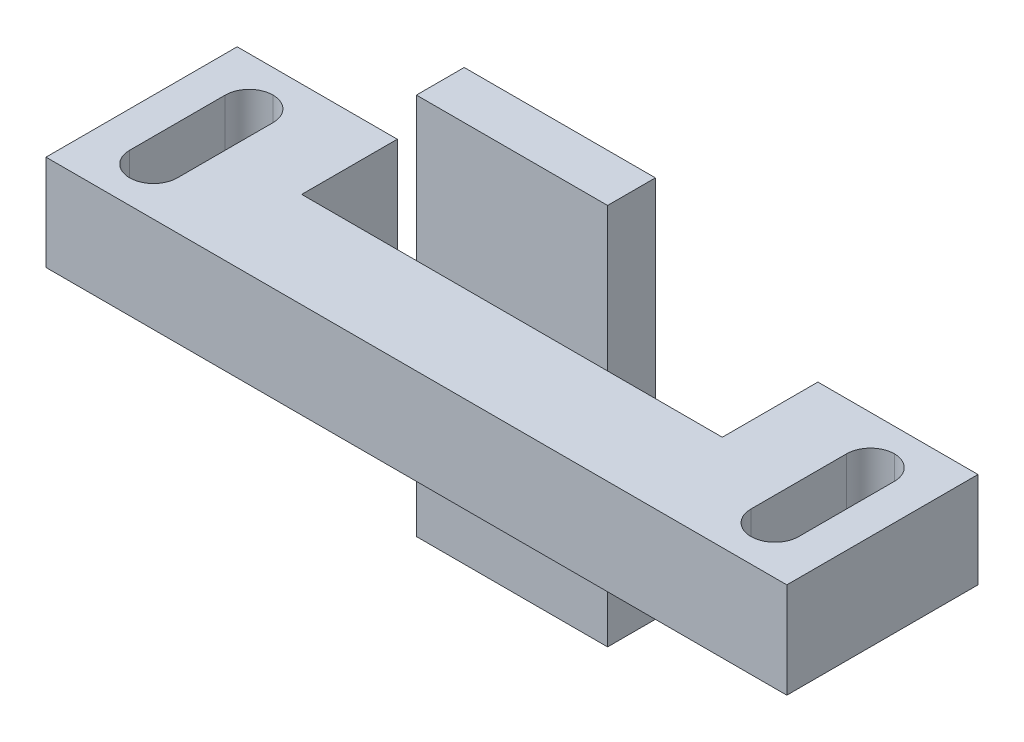
ISO-10303-21;
HEADER;
FILE_DESCRIPTION(('STEP AP214'),'2;1');
FILE_NAME('part.step','',(''),(''),'','','');
FILE_SCHEMA(('AUTOMOTIVE_DESIGN { 1 0 10303 214 1 1 1 1 }'));
ENDSEC;
DATA;
#1=APPLICATION_CONTEXT('core data for automotive mechanical design processes');
#2=APPLICATION_PROTOCOL_DEFINITION('international standard','automotive_design',2000,#1);
#3=PRODUCT_CONTEXT('',#1,'mechanical');
#4=PRODUCT('Part','Part','',(#3));
#5=PRODUCT_RELATED_PRODUCT_CATEGORY('part','',(#4));
#6=PRODUCT_DEFINITION_FORMATION('','',#4);
#7=PRODUCT_DEFINITION_CONTEXT('part definition',#1,'design');
#8=PRODUCT_DEFINITION('design','',#6,#7);
#9=PRODUCT_DEFINITION_SHAPE('','',#8);
#10=(LENGTH_UNIT() NAMED_UNIT(*) SI_UNIT(.MILLI.,.METRE.));
#11=(NAMED_UNIT(*) PLANE_ANGLE_UNIT() SI_UNIT($,.RADIAN.));
#12=(NAMED_UNIT(*) SI_UNIT($,.STERADIAN.) SOLID_ANGLE_UNIT());
#13=UNCERTAINTY_MEASURE_WITH_UNIT(LENGTH_MEASURE(1.E-05),#10,'distance_accuracy_value','');
#14=(GEOMETRIC_REPRESENTATION_CONTEXT(3) GLOBAL_UNCERTAINTY_ASSIGNED_CONTEXT((#13)) GLOBAL_UNIT_ASSIGNED_CONTEXT((#10,
#11,#12)) REPRESENTATION_CONTEXT('',''));
#15=CARTESIAN_POINT('',(0.,0.,0.));
#16=DIRECTION('',(0.,0.,1.));
#17=DIRECTION('',(1.,0.,0.));
#18=AXIS2_PLACEMENT_3D('',#15,#16,#17);
#19=CARTESIAN_POINT('',(-27.94,-6.351,0.));
#20=DIRECTION('',(0.,0.,1.));
#21=DIRECTION('',(1.,0.,0.));
#22=AXIS2_PLACEMENT_3D('',#19,#20,#21);
#23=PLANE('',#22);
#24=DIRECTION('',(0.,-1.,0.));
#25=VECTOR('',#24,1.);
#26=CARTESIAN_POINT('',(12.7,-6.35100000000001,0.));
#27=LINE('',#26,#25);
#28=CARTESIAN_POINT('',(12.7,6.35,0.));
#29=VERTEX_POINT('',#28);
#30=CARTESIAN_POINT('',(12.7,-6.35,0.));
#31=VERTEX_POINT('',#30);
#32=EDGE_CURVE('E11',#29,#31,#27,.T.);
#33=ORIENTED_EDGE('',*,*,#32,.F.);
#34=DIRECTION('',(1.,0.,0.));
#35=VECTOR('',#34,1.);
#36=CARTESIAN_POINT('',(-27.94,6.35,0.));
#37=LINE('',#36,#35);
#38=CARTESIAN_POINT('',(27.94,6.35,0.));
#39=VERTEX_POINT('',#38);
#40=EDGE_CURVE('E243',#29,#39,#37,.T.);
#41=ORIENTED_EDGE('',*,*,#40,.T.);
#42=DIRECTION('',(0.,1.,0.));
#43=VECTOR('',#42,1.);
#44=CARTESIAN_POINT('',(27.94,-6.351,0.));
#45=LINE('',#44,#43);
#46=CARTESIAN_POINT('',(27.94,-6.35,0.));
#47=VERTEX_POINT('',#46);
#48=EDGE_CURVE('E256',#47,#39,#45,.T.);
#49=ORIENTED_EDGE('',*,*,#48,.F.);
#50=DIRECTION('',(-1.,0.,0.));
#51=VECTOR('',#50,1.);
#52=CARTESIAN_POINT('',(-27.94,-6.35,0.));
#53=LINE('',#52,#51);
#54=EDGE_CURVE('E260',#47,#31,#53,.T.);
#55=ORIENTED_EDGE('',*,*,#54,.T.);
#56=EDGE_LOOP('',(#33,#41,#49,#55));
#57=FACE_BOUND('',#56,.T.);
#58=ADVANCED_FACE('F33',(#57),#23,.F.);
#59=DIRECTION('',(0.,1.,0.));
#60=VECTOR('',#59,1.);
#61=CARTESIAN_POINT('',(-12.7,-6.351,0.));
#62=LINE('',#61,#60);
#63=CARTESIAN_POINT('',(-12.7,-6.35,0.));
#64=VERTEX_POINT('',#63);
#65=CARTESIAN_POINT('',(-12.7,6.35,0.));
#66=VERTEX_POINT('',#65);
#67=EDGE_CURVE('E41',#64,#66,#62,.T.);
#68=ORIENTED_EDGE('',*,*,#67,.F.);
#69=CARTESIAN_POINT('',(-27.94,-6.35,0.));
#70=VERTEX_POINT('',#69);
#71=EDGE_CURVE('E252',#64,#70,#53,.T.);
#72=ORIENTED_EDGE('',*,*,#71,.T.);
#73=DIRECTION('',(0.,1.,0.));
#74=VECTOR('',#73,1.);
#75=CARTESIAN_POINT('',(-27.94,-6.351,0.));
#76=LINE('',#75,#74);
#77=CARTESIAN_POINT('',(-27.94,6.35,0.));
#78=VERTEX_POINT('',#77);
#79=EDGE_CURVE('E249',#70,#78,#76,.T.);
#80=ORIENTED_EDGE('',*,*,#79,.T.);
#81=EDGE_CURVE('E244',#78,#66,#37,.T.);
#82=ORIENTED_EDGE('',*,*,#81,.T.);
#83=EDGE_LOOP('',(#68,#72,#80,#82));
#84=FACE_BOUND('',#83,.T.);
#85=ADVANCED_FACE('F423',(#84),#23,.F.);
#86=CARTESIAN_POINT('',(0.,0.,-12.7));
#87=DIRECTION('',(0.,0.,1.));
#88=DIRECTION('',(1.,0.,0.));
#89=AXIS2_PLACEMENT_3D('',#86,#87,#88);
#90=PLANE('',#89);
#91=DIRECTION('',(-1.,0.,0.));
#92=VECTOR('',#91,1.);
#93=CARTESIAN_POINT('',(-49.2125,6.35,-12.7));
#94=LINE('',#93,#92);
#95=CARTESIAN_POINT('',(-27.94,6.35,-12.7));
#96=VERTEX_POINT('',#95);
#97=CARTESIAN_POINT('',(-49.2125,6.35,-12.7));
#98=VERTEX_POINT('',#97);
#99=EDGE_CURVE('E303',#96,#98,#94,.T.);
#100=ORIENTED_EDGE('',*,*,#99,.F.);
#101=DIRECTION('',(0.,1.,0.));
#102=VECTOR('',#101,1.);
#103=CARTESIAN_POINT('',(-27.94,-6.351,-12.7));
#104=LINE('',#103,#102);
#105=CARTESIAN_POINT('',(-27.94,-6.35,-12.7));
#106=VERTEX_POINT('',#105);
#107=EDGE_CURVE('E250',#106,#96,#104,.T.);
#108=ORIENTED_EDGE('',*,*,#107,.F.);
#109=DIRECTION('',(1.,0.,0.));
#110=VECTOR('',#109,1.);
#111=CARTESIAN_POINT('',(-49.2125,-6.35,-12.7));
#112=LINE('',#111,#110);
#113=CARTESIAN_POINT('',(-49.2125,-6.35,-12.7));
#114=VERTEX_POINT('',#113);
#115=EDGE_CURVE('E298',#114,#106,#112,.T.);
#116=ORIENTED_EDGE('',*,*,#115,.F.);
#117=DIRECTION('',(0.,-1.,0.));
#118=VECTOR('',#117,1.);
#119=CARTESIAN_POINT('',(-49.2125,6.35,-12.7));
#120=LINE('',#119,#118);
#121=EDGE_CURVE('E283',#98,#114,#120,.T.);
#122=ORIENTED_EDGE('',*,*,#121,.F.);
#123=EDGE_LOOP('',(#100,#108,#116,#122));
#124=FACE_BOUND('',#123,.T.);
#125=ADVANCED_FACE('F436',(#124),#90,.F.);
#126=CARTESIAN_POINT('',(41.275,-6.351,6.35));
#127=DIRECTION('',(0.,1.,0.));
#128=DIRECTION('',(0.,0.,1.));
#129=AXIS2_PLACEMENT_3D('',#126,#127,#128);
#130=CYLINDRICAL_SURFACE('',#129,3.175);
#131=DIRECTION('',(0.,-1.,0.));
#132=VECTOR('',#131,1.);
#133=CARTESIAN_POINT('',(38.1,-6.351,6.35));
#134=LINE('',#133,#132);
#135=CARTESIAN_POINT('',(38.1,6.35,6.35));
#136=VERTEX_POINT('',#135);
#137=CARTESIAN_POINT('',(38.1,-6.35,6.35));
#138=VERTEX_POINT('',#137);
#139=EDGE_CURVE('E384',#136,#138,#134,.T.);
#140=ORIENTED_EDGE('',*,*,#139,.F.);
#141=CARTESIAN_POINT('',(41.275,6.35,6.35));
#142=DIRECTION('',(0.,-1.,0.));
#143=DIRECTION('',(0.,0.,-1.));
#144=AXIS2_PLACEMENT_3D('',#141,#142,#143);
#145=CIRCLE('',#144,3.175);
#146=CARTESIAN_POINT('',(41.275,6.35,9.525));
#147=VERTEX_POINT('',#146);
#148=EDGE_CURVE('E387',#136,#147,#145,.F.);
#149=ORIENTED_EDGE('',*,*,#148,.T.);
#150=DIRECTION('',(0.,1.,0.));
#151=VECTOR('',#150,1.);
#152=CARTESIAN_POINT('',(41.275,-6.351,9.525));
#153=LINE('',#152,#151);
#154=CARTESIAN_POINT('',(41.275,-6.35,9.525));
#155=VERTEX_POINT('',#154);
#156=EDGE_CURVE('E376',#147,#155,#153,.F.);
#157=ORIENTED_EDGE('',*,*,#156,.T.);
#158=CARTESIAN_POINT('',(41.275,-6.35,6.35));
#159=DIRECTION('',(0.,1.,0.));
#160=DIRECTION('',(0.,0.,1.));
#161=AXIS2_PLACEMENT_3D('',#158,#159,#160);
#162=CIRCLE('',#161,3.175);
#163=EDGE_CURVE('E389',#155,#138,#162,.F.);
#164=ORIENTED_EDGE('',*,*,#163,.T.);
#165=EDGE_LOOP('',(#140,#149,#157,#164));
#166=FACE_BOUND('',#165,.T.);
#167=ADVANCED_FACE('F35',(#166),#130,.F.);
#168=CARTESIAN_POINT('',(41.275,-6.351,6.35));
#169=DIRECTION('',(0.,-1.,0.));
#170=DIRECTION('',(0.,0.,-1.));
#171=AXIS2_PLACEMENT_3D('',#168,#169,#170);
#172=CYLINDRICAL_SURFACE('',#171,3.175);
#173=DIRECTION('',(0.,1.,0.));
#174=VECTOR('',#173,1.);
#175=CARTESIAN_POINT('',(44.45,-6.351,6.35));
#176=LINE('',#175,#174);
#177=CARTESIAN_POINT('',(44.45,-6.35,6.35));
#178=VERTEX_POINT('',#177);
#179=CARTESIAN_POINT('',(44.45,6.35,6.35));
#180=VERTEX_POINT('',#179);
#181=EDGE_CURVE('E373',#178,#180,#176,.T.);
#182=ORIENTED_EDGE('',*,*,#181,.F.);
#183=CARTESIAN_POINT('',(41.275,-6.35,6.35));
#184=DIRECTION('',(0.,1.,0.));
#185=DIRECTION('',(0.,0.,1.));
#186=AXIS2_PLACEMENT_3D('',#183,#184,#185);
#187=CIRCLE('',#186,3.175);
#188=EDGE_CURVE('E379',#178,#155,#187,.F.);
#189=ORIENTED_EDGE('',*,*,#188,.T.);
#190=ORIENTED_EDGE('',*,*,#156,.F.);
#191=CARTESIAN_POINT('',(41.275,6.35,6.35));
#192=DIRECTION('',(0.,-1.,0.));
#193=DIRECTION('',(0.,0.,-1.));
#194=AXIS2_PLACEMENT_3D('',#191,#192,#193);
#195=CIRCLE('',#194,3.175);
#196=EDGE_CURVE('E382',#147,#180,#195,.F.);
#197=ORIENTED_EDGE('',*,*,#196,.T.);
#198=EDGE_LOOP('',(#182,#189,#190,#197));
#199=FACE_BOUND('',#198,.T.);
#200=ADVANCED_FACE('F517',(#199),#172,.F.);
#201=CARTESIAN_POINT('',(41.275,-6.351,-6.35));
#202=DIRECTION('',(0.,1.,0.));
#203=DIRECTION('',(0.,0.,1.));
#204=AXIS2_PLACEMENT_3D('',#201,#202,#203);
#205=CYLINDRICAL_SURFACE('',#204,3.175);
#206=DIRECTION('',(0.,-1.,0.));
#207=VECTOR('',#206,1.);
#208=CARTESIAN_POINT('',(38.1,-6.351,-6.35));
#209=LINE('',#208,#207);
#210=CARTESIAN_POINT('',(38.1,-6.35,-6.35));
#211=VERTEX_POINT('',#210);
#212=CARTESIAN_POINT('',(38.1,6.35,-6.35));
#213=VERTEX_POINT('',#212);
#214=EDGE_CURVE('E365',#211,#213,#209,.F.);
#215=ORIENTED_EDGE('',*,*,#214,.F.);
#216=CARTESIAN_POINT('',(41.275,-6.35,-6.35));
#217=DIRECTION('',(0.,1.,0.));
#218=DIRECTION('',(0.,0.,1.));
#219=AXIS2_PLACEMENT_3D('',#216,#217,#218);
#220=CIRCLE('',#219,3.175);
#221=CARTESIAN_POINT('',(41.275,-6.35,-9.525));
#222=VERTEX_POINT('',#221);
#223=EDGE_CURVE('E371',#211,#222,#220,.F.);
#224=ORIENTED_EDGE('',*,*,#223,.T.);
#225=DIRECTION('',(0.,-1.,0.));
#226=VECTOR('',#225,1.);
#227=CARTESIAN_POINT('',(41.275,-6.351,-9.525));
#228=LINE('',#227,#226);
#229=CARTESIAN_POINT('',(41.275,6.35,-9.525));
#230=VERTEX_POINT('',#229);
#231=EDGE_CURVE('E356',#222,#230,#228,.F.);
#232=ORIENTED_EDGE('',*,*,#231,.T.);
#233=CARTESIAN_POINT('',(41.275,6.35,-6.35));
#234=DIRECTION('',(0.,-1.,0.));
#235=DIRECTION('',(0.,0.,-1.));
#236=AXIS2_PLACEMENT_3D('',#233,#234,#235);
#237=CIRCLE('',#236,3.175);
#238=EDGE_CURVE('E368',#230,#213,#237,.F.);
#239=ORIENTED_EDGE('',*,*,#238,.T.);
#240=EDGE_LOOP('',(#215,#224,#232,#239));
#241=FACE_BOUND('',#240,.T.);
#242=ADVANCED_FACE('F511',(#241),#205,.F.);
#243=CARTESIAN_POINT('',(41.275,-6.351,-6.35));
#244=DIRECTION('',(0.,1.,0.));
#245=DIRECTION('',(0.,0.,1.));
#246=AXIS2_PLACEMENT_3D('',#243,#244,#245);
#247=CYLINDRICAL_SURFACE('',#246,3.175);
#248=DIRECTION('',(0.,-1.,0.));
#249=VECTOR('',#248,1.);
#250=CARTESIAN_POINT('',(44.45,-6.351,-6.35));
#251=LINE('',#250,#249);
#252=CARTESIAN_POINT('',(44.45,6.35,-6.35));
#253=VERTEX_POINT('',#252);
#254=CARTESIAN_POINT('',(44.45,-6.35,-6.35));
#255=VERTEX_POINT('',#254);
#256=EDGE_CURVE('E353',#253,#255,#251,.T.);
#257=ORIENTED_EDGE('',*,*,#256,.F.);
#258=CARTESIAN_POINT('',(41.275,6.35,-6.35));
#259=DIRECTION('',(0.,-1.,0.));
#260=DIRECTION('',(0.,0.,-1.));
#261=AXIS2_PLACEMENT_3D('',#258,#259,#260);
#262=CIRCLE('',#261,3.175);
#263=EDGE_CURVE('E359',#253,#230,#262,.F.);
#264=ORIENTED_EDGE('',*,*,#263,.T.);
#265=ORIENTED_EDGE('',*,*,#231,.F.);
#266=CARTESIAN_POINT('',(41.275,-6.35,-6.35));
#267=DIRECTION('',(0.,1.,0.));
#268=DIRECTION('',(0.,0.,1.));
#269=AXIS2_PLACEMENT_3D('',#266,#267,#268);
#270=CIRCLE('',#269,3.175);
#271=EDGE_CURVE('E362',#222,#255,#270,.F.);
#272=ORIENTED_EDGE('',*,*,#271,.T.);
#273=EDGE_LOOP('',(#257,#264,#265,#272));
#274=FACE_BOUND('',#273,.T.);
#275=ADVANCED_FACE('F507',(#274),#247,.F.);
#276=CARTESIAN_POINT('',(-49.2125,-6.35,12.7));
#277=DIRECTION('',(0.,1.,0.));
#278=DIRECTION('',(0.,0.,1.));
#279=AXIS2_PLACEMENT_3D('',#276,#277,#278);
#280=PLANE('',#279);
#281=ORIENTED_EDGE('',*,*,#115,.T.);
#282=DIRECTION('',(0.,0.,-1.));
#283=VECTOR('',#282,1.);
#284=CARTESIAN_POINT('',(-27.94,-6.35,-12.7));
#285=LINE('',#284,#283);
#286=EDGE_CURVE('E233',#70,#106,#285,.T.);
#287=ORIENTED_EDGE('',*,*,#286,.F.);
#288=ORIENTED_EDGE('',*,*,#71,.F.);
#289=EDGE_CURVE('E263',#31,#64,#53,.T.);
#290=ORIENTED_EDGE('',*,*,#289,.F.);
#291=ORIENTED_EDGE('',*,*,#54,.F.);
#292=DIRECTION('',(0.,0.,1.));
#293=VECTOR('',#292,1.);
#294=CARTESIAN_POINT('',(27.94,-6.35,-12.7));
#295=LINE('',#294,#293);
#296=CARTESIAN_POINT('',(27.94,-6.35,-12.7));
#297=VERTEX_POINT('',#296);
#298=EDGE_CURVE('E230',#297,#47,#295,.T.);
#299=ORIENTED_EDGE('',*,*,#298,.F.);
#300=CARTESIAN_POINT('',(49.2125,-6.35,-12.7));
#301=VERTEX_POINT('',#300);
#302=EDGE_CURVE('E297',#297,#301,#112,.T.);
#303=ORIENTED_EDGE('',*,*,#302,.T.);
#304=DIRECTION('',(0.,0.,-1.));
#305=VECTOR('',#304,1.);
#306=CARTESIAN_POINT('',(49.2125,-6.35,12.7));
#307=LINE('',#306,#305);
#308=CARTESIAN_POINT('',(49.2125,-6.35,12.7));
#309=VERTEX_POINT('',#308);
#310=EDGE_CURVE('E311',#309,#301,#307,.T.);
#311=ORIENTED_EDGE('',*,*,#310,.F.);
#312=DIRECTION('',(1.,0.,0.));
#313=VECTOR('',#312,1.);
#314=CARTESIAN_POINT('',(-49.2125,-6.35,12.7));
#315=LINE('',#314,#313);
#316=CARTESIAN_POINT('',(-49.2125,-6.35,12.7));
#317=VERTEX_POINT('',#316);
#318=EDGE_CURVE('E287',#317,#309,#315,.T.);
#319=ORIENTED_EDGE('',*,*,#318,.F.);
#320=DIRECTION('',(0.,0.,-1.));
#321=VECTOR('',#320,1.);
#322=CARTESIAN_POINT('',(-49.2125,-6.35,12.7));
#323=LINE('',#322,#321);
#324=EDGE_CURVE('E314',#317,#114,#323,.T.);
#325=ORIENTED_EDGE('',*,*,#324,.T.);
#326=EDGE_LOOP('',(#281,#287,#288,#290,#291,#299,#303,#311,#319,#325));
#327=FACE_BOUND('',#326,.T.);
#328=ORIENTED_EDGE('',*,*,#163,.F.);
#329=ORIENTED_EDGE('',*,*,#188,.F.);
#330=DIRECTION('',(0.,0.,-1.));
#331=VECTOR('',#330,1.);
#332=CARTESIAN_POINT('',(44.45,-6.35,-9.525));
#333=LINE('',#332,#331);
#334=EDGE_CURVE('E266',#178,#255,#333,.T.);
#335=ORIENTED_EDGE('',*,*,#334,.T.);
#336=ORIENTED_EDGE('',*,*,#271,.F.);
#337=ORIENTED_EDGE('',*,*,#223,.F.);
#338=DIRECTION('',(0.,0.,1.));
#339=VECTOR('',#338,1.);
#340=CARTESIAN_POINT('',(38.1,-6.35,-9.525));
#341=LINE('',#340,#339);
#342=EDGE_CURVE('E262',#211,#138,#341,.T.);
#343=ORIENTED_EDGE('',*,*,#342,.T.);
#344=EDGE_LOOP('',(#328,#329,#335,#336,#337,#343));
#345=FACE_BOUND('',#344,.T.);
#346=CARTESIAN_POINT('',(-41.275,-6.35,-6.35));
#347=DIRECTION('',(0.,1.,0.));
#348=DIRECTION('',(0.,0.,1.));
#349=AXIS2_PLACEMENT_3D('',#346,#347,#348);
#350=CIRCLE('',#349,3.175);
#351=CARTESIAN_POINT('',(-41.275,-6.35,-9.525));
#352=VERTEX_POINT('',#351);
#353=CARTESIAN_POINT('',(-38.1,-6.35,-6.35));
#354=VERTEX_POINT('',#353);
#355=EDGE_CURVE('E331',#352,#354,#350,.F.);
#356=ORIENTED_EDGE('',*,*,#355,.F.);
#357=CARTESIAN_POINT('',(-41.275,-6.35,-6.35));
#358=DIRECTION('',(0.,1.,0.));
#359=DIRECTION('',(0.,0.,1.));
#360=AXIS2_PLACEMENT_3D('',#357,#358,#359);
#361=CIRCLE('',#360,3.175);
#362=CARTESIAN_POINT('',(-44.45,-6.35,-6.35));
#363=VERTEX_POINT('',#362);
#364=EDGE_CURVE('E323',#363,#352,#361,.F.);
#365=ORIENTED_EDGE('',*,*,#364,.F.);
#366=DIRECTION('',(0.,0.,-1.));
#367=VECTOR('',#366,1.);
#368=CARTESIAN_POINT('',(-44.45,-6.35,-9.525));
#369=LINE('',#368,#367);
#370=CARTESIAN_POINT('',(-44.45,-6.35,6.35));
#371=VERTEX_POINT('',#370);
#372=EDGE_CURVE('E276',#371,#363,#369,.T.);
#373=ORIENTED_EDGE('',*,*,#372,.F.);
#374=CARTESIAN_POINT('',(-41.275,-6.35,6.35));
#375=DIRECTION('',(0.,1.,0.));
#376=DIRECTION('',(0.,0.,1.));
#377=AXIS2_PLACEMENT_3D('',#374,#375,#376);
#378=CIRCLE('',#377,3.175);
#379=CARTESIAN_POINT('',(-41.275,-6.35,9.525));
#380=VERTEX_POINT('',#379);
#381=EDGE_CURVE('E344',#380,#371,#378,.F.);
#382=ORIENTED_EDGE('',*,*,#381,.F.);
#383=CARTESIAN_POINT('',(-41.275,-6.35,6.35));
#384=DIRECTION('',(0.,1.,0.));
#385=DIRECTION('',(0.,0.,1.));
#386=AXIS2_PLACEMENT_3D('',#383,#384,#385);
#387=CIRCLE('',#386,3.175);
#388=CARTESIAN_POINT('',(-38.1,-6.35,6.35));
#389=VERTEX_POINT('',#388);
#390=EDGE_CURVE('E349',#389,#380,#387,.F.);
#391=ORIENTED_EDGE('',*,*,#390,.F.);
#392=DIRECTION('',(0.,0.,1.));
#393=VECTOR('',#392,1.);
#394=CARTESIAN_POINT('',(-38.1,-6.35,-9.525));
#395=LINE('',#394,#393);
#396=EDGE_CURVE('E273',#354,#389,#395,.T.);
#397=ORIENTED_EDGE('',*,*,#396,.F.);
#398=EDGE_LOOP('',(#356,#365,#373,#382,#391,#397));
#399=FACE_BOUND('',#398,.T.);
#400=ADVANCED_FACE('F430',(#327,#345,#399),#280,.F.);
#401=CARTESIAN_POINT('',(-49.2125,6.35,12.7));
#402=DIRECTION('',(0.,-1.,0.));
#403=DIRECTION('',(0.,0.,-1.));
#404=AXIS2_PLACEMENT_3D('',#401,#402,#403);
#405=PLANE('',#404);
#406=ORIENTED_EDGE('',*,*,#148,.F.);
#407=DIRECTION('',(0.,0.,-1.));
#408=VECTOR('',#407,1.);
#409=CARTESIAN_POINT('',(38.1,6.35,-9.525));
#410=LINE('',#409,#408);
#411=EDGE_CURVE('E271',#136,#213,#410,.T.);
#412=ORIENTED_EDGE('',*,*,#411,.T.);
#413=ORIENTED_EDGE('',*,*,#238,.F.);
#414=ORIENTED_EDGE('',*,*,#263,.F.);
#415=DIRECTION('',(0.,0.,1.));
#416=VECTOR('',#415,1.);
#417=CARTESIAN_POINT('',(44.45,6.35,-9.525));
#418=LINE('',#417,#416);
#419=EDGE_CURVE('E268',#253,#180,#418,.T.);
#420=ORIENTED_EDGE('',*,*,#419,.T.);
#421=ORIENTED_EDGE('',*,*,#196,.F.);
#422=EDGE_LOOP('',(#406,#412,#413,#414,#420,#421));
#423=FACE_BOUND('',#422,.T.);
#424=ORIENTED_EDGE('',*,*,#81,.F.);
#425=DIRECTION('',(0.,0.,1.));
#426=VECTOR('',#425,1.);
#427=CARTESIAN_POINT('',(-27.94,6.35,-12.7));
#428=LINE('',#427,#426);
#429=EDGE_CURVE('E240',#96,#78,#428,.T.);
#430=ORIENTED_EDGE('',*,*,#429,.F.);
#431=ORIENTED_EDGE('',*,*,#99,.T.);
#432=DIRECTION('',(0.,0.,-1.));
#433=VECTOR('',#432,1.);
#434=CARTESIAN_POINT('',(-49.2125,6.35,12.7));
#435=LINE('',#434,#433);
#436=CARTESIAN_POINT('',(-49.2125,6.35,12.7));
#437=VERTEX_POINT('',#436);
#438=EDGE_CURVE('E294',#437,#98,#435,.T.);
#439=ORIENTED_EDGE('',*,*,#438,.F.);
#440=DIRECTION('',(-1.,0.,0.));
#441=VECTOR('',#440,1.);
#442=CARTESIAN_POINT('',(-49.2125,6.35,12.7));
#443=LINE('',#442,#441);
#444=CARTESIAN_POINT('',(49.2125,6.35,12.7));
#445=VERTEX_POINT('',#444);
#446=EDGE_CURVE('E292',#445,#437,#443,.T.);
#447=ORIENTED_EDGE('',*,*,#446,.F.);
#448=DIRECTION('',(0.,0.,-1.));
#449=VECTOR('',#448,1.);
#450=CARTESIAN_POINT('',(49.2125,6.35,12.7));
#451=LINE('',#450,#449);
#452=CARTESIAN_POINT('',(49.2125,6.35,-12.7));
#453=VERTEX_POINT('',#452);
#454=EDGE_CURVE('E308',#445,#453,#451,.T.);
#455=ORIENTED_EDGE('',*,*,#454,.T.);
#456=CARTESIAN_POINT('',(27.94,6.35,-12.7));
#457=VERTEX_POINT('',#456);
#458=EDGE_CURVE('E288',#453,#457,#94,.T.);
#459=ORIENTED_EDGE('',*,*,#458,.T.);
#460=DIRECTION('',(0.,0.,-1.));
#461=VECTOR('',#460,1.);
#462=CARTESIAN_POINT('',(27.94,6.35,-12.7));
#463=LINE('',#462,#461);
#464=EDGE_CURVE('E246',#39,#457,#463,.T.);
#465=ORIENTED_EDGE('',*,*,#464,.F.);
#466=ORIENTED_EDGE('',*,*,#40,.F.);
#467=EDGE_CURVE('E247',#66,#29,#37,.T.);
#468=ORIENTED_EDGE('',*,*,#467,.F.);
#469=EDGE_LOOP('',(#424,#430,#431,#439,#447,#455,#459,#465,#466,#468));
#470=FACE_BOUND('',#469,.T.);
#471=CARTESIAN_POINT('',(-41.275,6.35,6.35));
#472=DIRECTION('',(0.,-1.,0.));
#473=DIRECTION('',(0.,0.,-1.));
#474=AXIS2_PLACEMENT_3D('',#471,#472,#473);
#475=CIRCLE('',#474,3.175);
#476=CARTESIAN_POINT('',(-41.275,6.35,9.525));
#477=VERTEX_POINT('',#476);
#478=CARTESIAN_POINT('',(-38.1,6.35,6.35));
#479=VERTEX_POINT('',#478);
#480=EDGE_CURVE('E351',#477,#479,#475,.F.);
#481=ORIENTED_EDGE('',*,*,#480,.F.);
#482=CARTESIAN_POINT('',(-41.275,6.35,6.35));
#483=DIRECTION('',(0.,-1.,0.));
#484=DIRECTION('',(0.,0.,-1.));
#485=AXIS2_PLACEMENT_3D('',#482,#483,#484);
#486=CIRCLE('',#485,3.175);
#487=CARTESIAN_POINT('',(-44.45,6.35,6.35));
#488=VERTEX_POINT('',#487);
#489=EDGE_CURVE('E341',#488,#477,#486,.F.);
#490=ORIENTED_EDGE('',*,*,#489,.F.);
#491=DIRECTION('',(0.,0.,1.));
#492=VECTOR('',#491,1.);
#493=CARTESIAN_POINT('',(-44.45,6.35,-9.525));
#494=LINE('',#493,#492);
#495=CARTESIAN_POINT('',(-44.45,6.35,-6.35));
#496=VERTEX_POINT('',#495);
#497=EDGE_CURVE('E278',#496,#488,#494,.T.);
#498=ORIENTED_EDGE('',*,*,#497,.F.);
#499=CARTESIAN_POINT('',(-41.275,6.35,-6.35));
#500=DIRECTION('',(0.,-1.,0.));
#501=DIRECTION('',(0.,0.,-1.));
#502=AXIS2_PLACEMENT_3D('',#499,#500,#501);
#503=CIRCLE('',#502,3.175);
#504=CARTESIAN_POINT('',(-41.275,6.35,-9.525));
#505=VERTEX_POINT('',#504);
#506=EDGE_CURVE('E326',#505,#496,#503,.F.);
#507=ORIENTED_EDGE('',*,*,#506,.F.);
#508=CARTESIAN_POINT('',(-41.275,6.35,-6.35));
#509=DIRECTION('',(0.,-1.,0.));
#510=DIRECTION('',(0.,0.,-1.));
#511=AXIS2_PLACEMENT_3D('',#508,#509,#510);
#512=CIRCLE('',#511,3.175);
#513=CARTESIAN_POINT('',(-38.1,6.35,-6.35));
#514=VERTEX_POINT('',#513);
#515=EDGE_CURVE('E333',#514,#505,#512,.F.);
#516=ORIENTED_EDGE('',*,*,#515,.F.);
#517=DIRECTION('',(0.,0.,-1.));
#518=VECTOR('',#517,1.);
#519=CARTESIAN_POINT('',(-38.1,6.35,-9.525));
#520=LINE('',#519,#518);
#521=EDGE_CURVE('E281',#479,#514,#520,.T.);
#522=ORIENTED_EDGE('',*,*,#521,.F.);
#523=EDGE_LOOP('',(#481,#490,#498,#507,#516,#522));
#524=FACE_BOUND('',#523,.T.);
#525=ADVANCED_FACE('F438',(#423,#470,#524),#405,.F.);
#526=CARTESIAN_POINT('',(-41.275,-6.351,6.35));
#527=DIRECTION('',(0.,-1.,0.));
#528=DIRECTION('',(0.,0.,-1.));
#529=AXIS2_PLACEMENT_3D('',#526,#527,#528);
#530=CYLINDRICAL_SURFACE('',#529,3.175);
#531=DIRECTION('',(0.,1.,0.));
#532=VECTOR('',#531,1.);
#533=CARTESIAN_POINT('',(-38.1,-6.351,6.35));
#534=LINE('',#533,#532);
#535=EDGE_CURVE('E346',#389,#479,#534,.T.);
#536=ORIENTED_EDGE('',*,*,#535,.F.);
#537=ORIENTED_EDGE('',*,*,#390,.T.);
#538=DIRECTION('',(0.,-1.,0.));
#539=VECTOR('',#538,1.);
#540=CARTESIAN_POINT('',(-41.275,-6.351,9.525));
#541=LINE('',#540,#539);
#542=EDGE_CURVE('E338',#380,#477,#541,.F.);
#543=ORIENTED_EDGE('',*,*,#542,.T.);
#544=ORIENTED_EDGE('',*,*,#480,.T.);
#545=EDGE_LOOP('',(#536,#537,#543,#544));
#546=FACE_BOUND('',#545,.T.);
#547=ADVANCED_FACE('F504',(#546),#530,.F.);
#548=CARTESIAN_POINT('',(-41.275,-6.351,6.35));
#549=DIRECTION('',(0.,1.,0.));
#550=DIRECTION('',(0.,0.,1.));
#551=AXIS2_PLACEMENT_3D('',#548,#549,#550);
#552=CYLINDRICAL_SURFACE('',#551,3.175);
#553=DIRECTION('',(0.,-1.,0.));
#554=VECTOR('',#553,1.);
#555=CARTESIAN_POINT('',(-44.45,-6.351,6.35));
#556=LINE('',#555,#554);
#557=EDGE_CURVE('E335',#488,#371,#556,.T.);
#558=ORIENTED_EDGE('',*,*,#557,.F.);
#559=ORIENTED_EDGE('',*,*,#489,.T.);
#560=ORIENTED_EDGE('',*,*,#542,.F.);
#561=ORIENTED_EDGE('',*,*,#381,.T.);
#562=EDGE_LOOP('',(#558,#559,#560,#561));
#563=FACE_BOUND('',#562,.T.);
#564=ADVANCED_FACE('F557',(#563),#552,.F.);
#565=CARTESIAN_POINT('',(-41.275,-6.351,-6.35));
#566=DIRECTION('',(0.,-1.,0.));
#567=DIRECTION('',(0.,0.,-1.));
#568=AXIS2_PLACEMENT_3D('',#565,#566,#567);
#569=CYLINDRICAL_SURFACE('',#568,3.175);
#570=DIRECTION('',(0.,1.,0.));
#571=VECTOR('',#570,1.);
#572=CARTESIAN_POINT('',(-38.1,-6.351,-6.35));
#573=LINE('',#572,#571);
#574=EDGE_CURVE('E328',#514,#354,#573,.F.);
#575=ORIENTED_EDGE('',*,*,#574,.F.);
#576=ORIENTED_EDGE('',*,*,#515,.T.);
#577=DIRECTION('',(0.,1.,0.));
#578=VECTOR('',#577,1.);
#579=CARTESIAN_POINT('',(-41.275,-6.351,-9.525));
#580=LINE('',#579,#578);
#581=EDGE_CURVE('E320',#505,#352,#580,.F.);
#582=ORIENTED_EDGE('',*,*,#581,.T.);
#583=ORIENTED_EDGE('',*,*,#355,.T.);
#584=EDGE_LOOP('',(#575,#576,#582,#583));
#585=FACE_BOUND('',#584,.T.);
#586=ADVANCED_FACE('F469',(#585),#569,.F.);
#587=CARTESIAN_POINT('',(-41.275,-6.351,-6.35));
#588=DIRECTION('',(0.,-1.,0.));
#589=DIRECTION('',(0.,0.,-1.));
#590=AXIS2_PLACEMENT_3D('',#587,#588,#589);
#591=CYLINDRICAL_SURFACE('',#590,3.175);
#592=DIRECTION('',(0.,1.,0.));
#593=VECTOR('',#592,1.);
#594=CARTESIAN_POINT('',(-44.45,-6.351,-6.35));
#595=LINE('',#594,#593);
#596=EDGE_CURVE('E317',#363,#496,#595,.T.);
#597=ORIENTED_EDGE('',*,*,#596,.F.);
#598=ORIENTED_EDGE('',*,*,#364,.T.);
#599=ORIENTED_EDGE('',*,*,#581,.F.);
#600=ORIENTED_EDGE('',*,*,#506,.T.);
#601=EDGE_LOOP('',(#597,#598,#599,#600));
#602=FACE_BOUND('',#601,.T.);
#603=ADVANCED_FACE('F462',(#602),#591,.F.);
#604=CARTESIAN_POINT('',(-49.2125,6.35,12.7));
#605=DIRECTION('',(1.,0.,0.));
#606=DIRECTION('',(0.,0.,-1.));
#607=AXIS2_PLACEMENT_3D('',#604,#605,#606);
#608=PLANE('',#607);
#609=ORIENTED_EDGE('',*,*,#121,.T.);
#610=ORIENTED_EDGE('',*,*,#324,.F.);
#611=DIRECTION('',(0.,-1.,0.));
#612=VECTOR('',#611,1.);
#613=CARTESIAN_POINT('',(-49.2125,6.35,12.7));
#614=LINE('',#613,#612);
#615=EDGE_CURVE('E284',#437,#317,#614,.T.);
#616=ORIENTED_EDGE('',*,*,#615,.F.);
#617=ORIENTED_EDGE('',*,*,#438,.T.);
#618=EDGE_LOOP('',(#609,#610,#616,#617));
#619=FACE_BOUND('',#618,.T.);
#620=ADVANCED_FACE('F460',(#619),#608,.F.);
#621=CARTESIAN_POINT('',(49.2125,6.35,12.7));
#622=DIRECTION('',(-1.,0.,0.));
#623=DIRECTION('',(0.,0.,1.));
#624=AXIS2_PLACEMENT_3D('',#621,#622,#623);
#625=PLANE('',#624);
#626=DIRECTION('',(0.,1.,0.));
#627=VECTOR('',#626,1.);
#628=CARTESIAN_POINT('',(49.2125,6.35,-12.7));
#629=LINE('',#628,#627);
#630=EDGE_CURVE('E301',#301,#453,#629,.T.);
#631=ORIENTED_EDGE('',*,*,#630,.T.);
#632=ORIENTED_EDGE('',*,*,#454,.F.);
#633=DIRECTION('',(0.,1.,0.));
#634=VECTOR('',#633,1.);
#635=CARTESIAN_POINT('',(49.2125,6.35,12.7));
#636=LINE('',#635,#634);
#637=EDGE_CURVE('E290',#309,#445,#636,.T.);
#638=ORIENTED_EDGE('',*,*,#637,.F.);
#639=ORIENTED_EDGE('',*,*,#310,.T.);
#640=EDGE_LOOP('',(#631,#632,#638,#639));
#641=FACE_BOUND('',#640,.T.);
#642=ADVANCED_FACE('F455',(#641),#625,.F.);
#643=CARTESIAN_POINT('',(0.,0.,12.7));
#644=DIRECTION('',(0.,0.,1.));
#645=DIRECTION('',(1.,0.,0.));
#646=AXIS2_PLACEMENT_3D('',#643,#644,#645);
#647=PLANE('',#646);
#648=ORIENTED_EDGE('',*,*,#615,.T.);
#649=ORIENTED_EDGE('',*,*,#318,.T.);
#650=ORIENTED_EDGE('',*,*,#637,.T.);
#651=ORIENTED_EDGE('',*,*,#446,.T.);
#652=EDGE_LOOP('',(#648,#649,#650,#651));
#653=FACE_BOUND('',#652,.T.);
#654=ADVANCED_FACE('F457',(#653),#647,.T.);
#655=ORIENTED_EDGE('',*,*,#302,.F.);
#656=DIRECTION('',(0.,1.,0.));
#657=VECTOR('',#656,1.);
#658=CARTESIAN_POINT('',(27.94,-6.351,-12.7));
#659=LINE('',#658,#657);
#660=EDGE_CURVE('E253',#297,#457,#659,.T.);
#661=ORIENTED_EDGE('',*,*,#660,.T.);
#662=ORIENTED_EDGE('',*,*,#458,.F.);
#663=ORIENTED_EDGE('',*,*,#630,.F.);
#664=EDGE_LOOP('',(#655,#661,#662,#663));
#665=FACE_BOUND('',#664,.T.);
#666=ADVANCED_FACE('F451',(#665),#90,.F.);
#667=CARTESIAN_POINT('',(-44.45,-6.351,-9.525));
#668=DIRECTION('',(-1.,0.,0.));
#669=DIRECTION('',(0.,0.,1.));
#670=AXIS2_PLACEMENT_3D('',#667,#668,#669);
#671=PLANE('',#670);
#672=ORIENTED_EDGE('',*,*,#497,.T.);
#673=ORIENTED_EDGE('',*,*,#557,.T.);
#674=ORIENTED_EDGE('',*,*,#372,.T.);
#675=ORIENTED_EDGE('',*,*,#596,.T.);
#676=EDGE_LOOP('',(#672,#673,#674,#675));
#677=FACE_BOUND('',#676,.T.);
#678=ADVANCED_FACE('F494',(#677),#671,.F.);
#679=CARTESIAN_POINT('',(-38.1,-6.351,-9.525));
#680=DIRECTION('',(1.,0.,0.));
#681=DIRECTION('',(0.,0.,-1.));
#682=AXIS2_PLACEMENT_3D('',#679,#680,#681);
#683=PLANE('',#682);
#684=ORIENTED_EDGE('',*,*,#396,.T.);
#685=ORIENTED_EDGE('',*,*,#535,.T.);
#686=ORIENTED_EDGE('',*,*,#521,.T.);
#687=ORIENTED_EDGE('',*,*,#574,.T.);
#688=EDGE_LOOP('',(#684,#685,#686,#687));
#689=FACE_BOUND('',#688,.T.);
#690=ADVANCED_FACE('F490',(#689),#683,.F.);
#691=CARTESIAN_POINT('',(44.45,-6.351,-9.525));
#692=DIRECTION('',(-1.,0.,0.));
#693=DIRECTION('',(0.,0.,1.));
#694=AXIS2_PLACEMENT_3D('',#691,#692,#693);
#695=PLANE('',#694);
#696=ORIENTED_EDGE('',*,*,#334,.F.);
#697=ORIENTED_EDGE('',*,*,#181,.T.);
#698=ORIENTED_EDGE('',*,*,#419,.F.);
#699=ORIENTED_EDGE('',*,*,#256,.T.);
#700=EDGE_LOOP('',(#696,#697,#698,#699));
#701=FACE_BOUND('',#700,.T.);
#702=ADVANCED_FACE('F486',(#701),#695,.T.);
#703=CARTESIAN_POINT('',(38.1,-6.351,-9.525));
#704=DIRECTION('',(1.,0.,0.));
#705=DIRECTION('',(0.,0.,-1.));
#706=AXIS2_PLACEMENT_3D('',#703,#704,#705);
#707=PLANE('',#706);
#708=ORIENTED_EDGE('',*,*,#411,.F.);
#709=ORIENTED_EDGE('',*,*,#139,.T.);
#710=ORIENTED_EDGE('',*,*,#342,.F.);
#711=ORIENTED_EDGE('',*,*,#214,.T.);
#712=EDGE_LOOP('',(#708,#709,#710,#711));
#713=FACE_BOUND('',#712,.T.);
#714=ADVANCED_FACE('F483',(#713),#707,.T.);
#715=CARTESIAN_POINT('',(-27.94,-6.351,-12.7));
#716=DIRECTION('',(-1.,0.,0.));
#717=DIRECTION('',(0.,0.,1.));
#718=AXIS2_PLACEMENT_3D('',#715,#716,#717);
#719=PLANE('',#718);
#720=ORIENTED_EDGE('',*,*,#286,.T.);
#721=ORIENTED_EDGE('',*,*,#107,.T.);
#722=ORIENTED_EDGE('',*,*,#429,.T.);
#723=ORIENTED_EDGE('',*,*,#79,.F.);
#724=EDGE_LOOP('',(#720,#721,#722,#723));
#725=FACE_BOUND('',#724,.T.);
#726=ADVANCED_FACE('F426',(#725),#719,.F.);
#727=CARTESIAN_POINT('',(27.94,-6.351,-12.7));
#728=DIRECTION('',(1.,0.,0.));
#729=DIRECTION('',(0.,0.,-1.));
#730=AXIS2_PLACEMENT_3D('',#727,#728,#729);
#731=PLANE('',#730);
#732=ORIENTED_EDGE('',*,*,#298,.T.);
#733=ORIENTED_EDGE('',*,*,#48,.T.);
#734=ORIENTED_EDGE('',*,*,#464,.T.);
#735=ORIENTED_EDGE('',*,*,#660,.F.);
#736=EDGE_LOOP('',(#732,#733,#734,#735));
#737=FACE_BOUND('',#736,.T.);
#738=ADVANCED_FACE('F443',(#737),#731,.F.);
#739=CARTESIAN_POINT('',(0.,0.,0.));
#740=DIRECTION('',(0.,0.,-1.));
#741=DIRECTION('',(-1.,0.,0.));
#742=AXIS2_PLACEMENT_3D('',#739,#740,#741);
#743=PLANE('',#742);
#744=DIRECTION('',(0.,-1.,0.));
#745=VECTOR('',#744,1.);
#746=CARTESIAN_POINT('',(12.7,25.4,0.));
#747=LINE('',#746,#745);
#748=CARTESIAN_POINT('',(12.7,-25.4,0.));
#749=VERTEX_POINT('',#748);
#750=EDGE_CURVE('E228',#31,#749,#747,.T.);
#751=ORIENTED_EDGE('',*,*,#750,.F.);
#752=ORIENTED_EDGE('',*,*,#289,.T.);
#753=DIRECTION('',(0.,1.,0.));
#754=VECTOR('',#753,1.);
#755=CARTESIAN_POINT('',(-12.7,25.4,0.));
#756=LINE('',#755,#754);
#757=CARTESIAN_POINT('',(-12.7,-25.4,0.));
#758=VERTEX_POINT('',#757);
#759=EDGE_CURVE('E398',#758,#64,#756,.T.);
#760=ORIENTED_EDGE('',*,*,#759,.F.);
#761=DIRECTION('',(-1.,0.,0.));
#762=VECTOR('',#761,1.);
#763=CARTESIAN_POINT('',(12.7,-25.4,0.));
#764=LINE('',#763,#762);
#765=EDGE_CURVE('E403',#749,#758,#764,.T.);
#766=ORIENTED_EDGE('',*,*,#765,.F.);
#767=EDGE_LOOP('',(#751,#752,#760,#766));
#768=FACE_BOUND('',#767,.T.);
#769=ADVANCED_FACE('F419',(#768),#743,.F.);
#770=CARTESIAN_POINT('',(-12.7,25.4,0.));
#771=VERTEX_POINT('',#770);
#772=EDGE_CURVE('E395',#66,#771,#756,.T.);
#773=ORIENTED_EDGE('',*,*,#772,.F.);
#774=ORIENTED_EDGE('',*,*,#467,.T.);
#775=CARTESIAN_POINT('',(12.7,25.4,0.));
#776=VERTEX_POINT('',#775);
#777=EDGE_CURVE('E415',#776,#29,#747,.T.);
#778=ORIENTED_EDGE('',*,*,#777,.F.);
#779=DIRECTION('',(1.,0.,0.));
#780=VECTOR('',#779,1.);
#781=CARTESIAN_POINT('',(12.7,25.4,0.));
#782=LINE('',#781,#780);
#783=EDGE_CURVE('E223',#771,#776,#782,.T.);
#784=ORIENTED_EDGE('',*,*,#783,.F.);
#785=EDGE_LOOP('',(#773,#774,#778,#784));
#786=FACE_BOUND('',#785,.T.);
#787=ADVANCED_FACE('F413',(#786),#743,.F.);
#788=CARTESIAN_POINT('',(12.7,25.4,-6.35));
#789=DIRECTION('',(-1.,0.,0.));
#790=DIRECTION('',(0.,-1.,0.));
#791=AXIS2_PLACEMENT_3D('',#788,#789,#790);
#792=PLANE('',#791);
#793=ORIENTED_EDGE('',*,*,#777,.T.);
#794=ORIENTED_EDGE('',*,*,#32,.T.);
#795=ORIENTED_EDGE('',*,*,#750,.T.);
#796=DIRECTION('',(0.,0.,1.));
#797=VECTOR('',#796,1.);
#798=CARTESIAN_POINT('',(12.7,-25.4,-6.35));
#799=LINE('',#798,#797);
#800=CARTESIAN_POINT('',(12.7,-25.4,-6.35));
#801=VERTEX_POINT('',#800);
#802=EDGE_CURVE('E208',#801,#749,#799,.T.);
#803=ORIENTED_EDGE('',*,*,#802,.F.);
#804=DIRECTION('',(0.,-1.,0.));
#805=VECTOR('',#804,1.);
#806=CARTESIAN_POINT('',(12.7,25.4,-6.35));
#807=LINE('',#806,#805);
#808=CARTESIAN_POINT('',(12.7,25.4,-6.35));
#809=VERTEX_POINT('',#808);
#810=EDGE_CURVE('E214',#809,#801,#807,.T.);
#811=ORIENTED_EDGE('',*,*,#810,.F.);
#812=DIRECTION('',(0.,0.,1.));
#813=VECTOR('',#812,1.);
#814=CARTESIAN_POINT('',(12.7,25.4,-6.35));
#815=LINE('',#814,#813);
#816=EDGE_CURVE('E407',#809,#776,#815,.T.);
#817=ORIENTED_EDGE('',*,*,#816,.T.);
#818=EDGE_LOOP('',(#793,#794,#795,#803,#811,#817));
#819=FACE_BOUND('',#818,.T.);
#820=ADVANCED_FACE('F226',(#819),#792,.F.);
#821=CARTESIAN_POINT('',(12.7,-25.4,-6.35));
#822=DIRECTION('',(0.,1.,0.));
#823=DIRECTION('',(0.,0.,1.));
#824=AXIS2_PLACEMENT_3D('',#821,#822,#823);
#825=PLANE('',#824);
#826=ORIENTED_EDGE('',*,*,#765,.T.);
#827=DIRECTION('',(0.,0.,1.));
#828=VECTOR('',#827,1.);
#829=CARTESIAN_POINT('',(-12.7,-25.4,-6.35));
#830=LINE('',#829,#828);
#831=CARTESIAN_POINT('',(-12.7,-25.4,-6.35));
#832=VERTEX_POINT('',#831);
#833=EDGE_CURVE('E210',#832,#758,#830,.T.);
#834=ORIENTED_EDGE('',*,*,#833,.F.);
#835=DIRECTION('',(-1.,0.,0.));
#836=VECTOR('',#835,1.);
#837=CARTESIAN_POINT('',(12.7,-25.4,-6.35));
#838=LINE('',#837,#836);
#839=EDGE_CURVE('E204',#801,#832,#838,.T.);
#840=ORIENTED_EDGE('',*,*,#839,.F.);
#841=ORIENTED_EDGE('',*,*,#802,.T.);
#842=EDGE_LOOP('',(#826,#834,#840,#841));
#843=FACE_BOUND('',#842,.T.);
#844=ADVANCED_FACE('F206',(#843),#825,.F.);
#845=CARTESIAN_POINT('',(-12.7,25.4,-6.35));
#846=DIRECTION('',(1.,0.,0.));
#847=DIRECTION('',(0.,1.,0.));
#848=AXIS2_PLACEMENT_3D('',#845,#846,#847);
#849=PLANE('',#848);
#850=ORIENTED_EDGE('',*,*,#759,.T.);
#851=ORIENTED_EDGE('',*,*,#67,.T.);
#852=ORIENTED_EDGE('',*,*,#772,.T.);
#853=DIRECTION('',(0.,0.,1.));
#854=VECTOR('',#853,1.);
#855=CARTESIAN_POINT('',(-12.7,25.4,-6.35));
#856=LINE('',#855,#854);
#857=CARTESIAN_POINT('',(-12.7,25.4,-6.35));
#858=VERTEX_POINT('',#857);
#859=EDGE_CURVE('E235',#858,#771,#856,.T.);
#860=ORIENTED_EDGE('',*,*,#859,.F.);
#861=DIRECTION('',(0.,1.,0.));
#862=VECTOR('',#861,1.);
#863=CARTESIAN_POINT('',(-12.7,25.4,-6.35));
#864=LINE('',#863,#862);
#865=EDGE_CURVE('E213',#832,#858,#864,.T.);
#866=ORIENTED_EDGE('',*,*,#865,.F.);
#867=ORIENTED_EDGE('',*,*,#833,.T.);
#868=EDGE_LOOP('',(#850,#851,#852,#860,#866,#867));
#869=FACE_BOUND('',#868,.T.);
#870=ADVANCED_FACE('F392',(#869),#849,.F.);
#871=CARTESIAN_POINT('',(12.7,25.4,-6.35));
#872=DIRECTION('',(0.,-1.,0.));
#873=DIRECTION('',(0.,0.,-1.));
#874=AXIS2_PLACEMENT_3D('',#871,#872,#873);
#875=PLANE('',#874);
#876=ORIENTED_EDGE('',*,*,#783,.T.);
#877=ORIENTED_EDGE('',*,*,#816,.F.);
#878=DIRECTION('',(1.,0.,0.));
#879=VECTOR('',#878,1.);
#880=CARTESIAN_POINT('',(12.7,25.4,-6.35));
#881=LINE('',#880,#879);
#882=EDGE_CURVE('E219',#858,#809,#881,.T.);
#883=ORIENTED_EDGE('',*,*,#882,.F.);
#884=ORIENTED_EDGE('',*,*,#859,.T.);
#885=EDGE_LOOP('',(#876,#877,#883,#884));
#886=FACE_BOUND('',#885,.T.);
#887=ADVANCED_FACE('F410',(#886),#875,.F.);
#888=CARTESIAN_POINT('',(0.,0.,-6.35));
#889=DIRECTION('',(0.,0.,-1.));
#890=DIRECTION('',(-1.,0.,0.));
#891=AXIS2_PLACEMENT_3D('',#888,#889,#890);
#892=PLANE('',#891);
#893=ORIENTED_EDGE('',*,*,#810,.T.);
#894=ORIENTED_EDGE('',*,*,#839,.T.);
#895=ORIENTED_EDGE('',*,*,#865,.T.);
#896=ORIENTED_EDGE('',*,*,#882,.T.);
#897=EDGE_LOOP('',(#893,#894,#895,#896));
#898=FACE_BOUND('',#897,.T.);
#899=ADVANCED_FACE('F217',(#898),#892,.T.);
#900=CLOSED_SHELL('',(#58,#85,#125,#167,#200,#242,#275,#400,#525,#547,#564,#586,#603,#620,#642,
#654,#666,#678,#690,#702,#714,#726,#738,#769,#787,#820,#844,#870,#887,#899));
#901=MANIFOLD_SOLID_BREP('B2',#900);
#902=ADVANCED_BREP_SHAPE_REPRESENTATION('',(#18,#901),#14);
#903=SHAPE_DEFINITION_REPRESENTATION(#9,#902);
ENDSEC;
END-ISO-10303-21;
